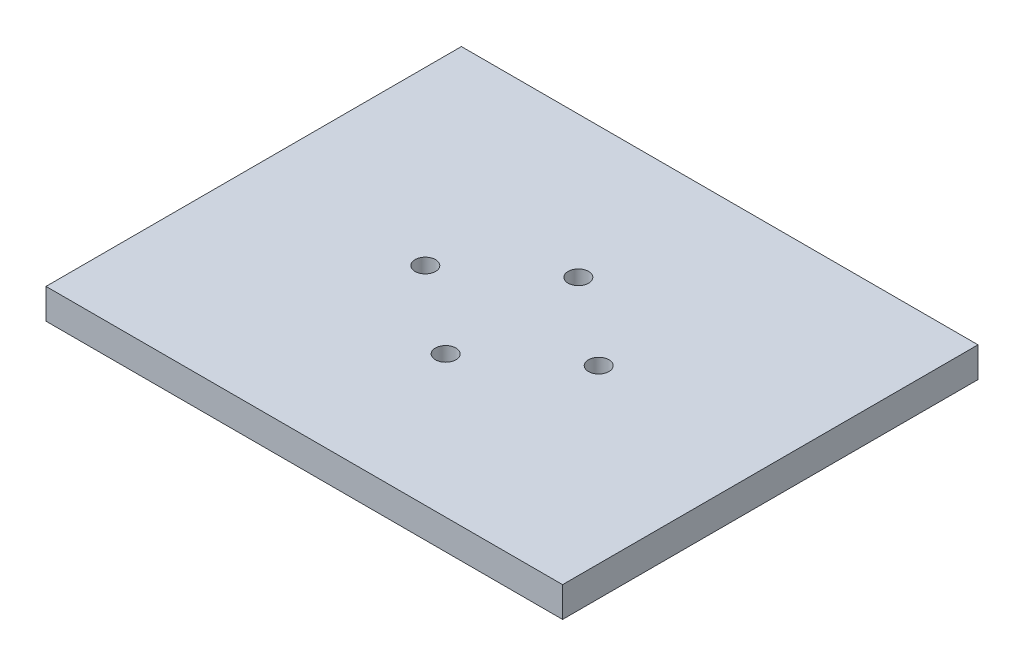
ISO-10303-21;
HEADER;
FILE_DESCRIPTION(('STEP AP214'),'2;1');
FILE_NAME('part.step','',(''),(''),'','','');
FILE_SCHEMA(('AUTOMOTIVE_DESIGN { 1 0 10303 214 1 1 1 1 }'));
ENDSEC;
DATA;
#1=APPLICATION_CONTEXT('core data for automotive mechanical design processes');
#2=APPLICATION_PROTOCOL_DEFINITION('international standard','automotive_design',2000,#1);
#3=PRODUCT_CONTEXT('',#1,'mechanical');
#4=PRODUCT('Part','Part','',(#3));
#5=PRODUCT_RELATED_PRODUCT_CATEGORY('part','',(#4));
#6=PRODUCT_DEFINITION_FORMATION('','',#4);
#7=PRODUCT_DEFINITION_CONTEXT('part definition',#1,'design');
#8=PRODUCT_DEFINITION('design','',#6,#7);
#9=PRODUCT_DEFINITION_SHAPE('','',#8);
#10=(LENGTH_UNIT() NAMED_UNIT(*) SI_UNIT(.MILLI.,.METRE.));
#11=(NAMED_UNIT(*) PLANE_ANGLE_UNIT() SI_UNIT($,.RADIAN.));
#12=(NAMED_UNIT(*) SI_UNIT($,.STERADIAN.) SOLID_ANGLE_UNIT());
#13=UNCERTAINTY_MEASURE_WITH_UNIT(LENGTH_MEASURE(1.E-05),#10,'distance_accuracy_value','');
#14=(GEOMETRIC_REPRESENTATION_CONTEXT(3) GLOBAL_UNCERTAINTY_ASSIGNED_CONTEXT((#13)) GLOBAL_UNIT_ASSIGNED_CONTEXT((#10,
#11,#12)) REPRESENTATION_CONTEXT('',''));
#15=CARTESIAN_POINT('',(0.,0.,0.));
#16=DIRECTION('',(0.,0.,1.));
#17=DIRECTION('',(1.,0.,0.));
#18=AXIS2_PLACEMENT_3D('',#15,#16,#17);
#19=CARTESIAN_POINT('',(0.,5.,0.));
#20=DIRECTION('',(0.,1.,0.));
#21=DIRECTION('',(0.,0.,1.));
#22=AXIS2_PLACEMENT_3D('',#19,#20,#21);
#23=PLANE('',#22);
#24=CARTESIAN_POINT('',(14.375,5.,0.));
#25=DIRECTION('',(0.,1.,0.));
#26=DIRECTION('',(0.,0.,-1.));
#27=AXIS2_PLACEMENT_3D('',#24,#25,#26);
#28=CIRCLE('',#27,1.7);
#29=CARTESIAN_POINT('',(14.375,5.,-1.7));
#30=VERTEX_POINT('',#29);
#31=EDGE_CURVE('E140',#30,#30,#28,.T.);
#32=ORIENTED_EDGE('',*,*,#31,.F.);
#33=EDGE_LOOP('',(#32));
#34=FACE_BOUND('',#33,.T.);
#35=CARTESIAN_POINT('',(0.,5.,11.));
#36=DIRECTION('',(0.,1.,0.));
#37=DIRECTION('',(0.,0.,-1.));
#38=AXIS2_PLACEMENT_3D('',#35,#36,#37);
#39=CIRCLE('',#38,1.7);
#40=CARTESIAN_POINT('',(0.,5.,9.3));
#41=VERTEX_POINT('',#40);
#42=EDGE_CURVE('E106',#41,#41,#39,.T.);
#43=ORIENTED_EDGE('',*,*,#42,.F.);
#44=EDGE_LOOP('',(#43));
#45=FACE_BOUND('',#44,.T.);
#46=DIRECTION('',(0.,0.,1.));
#47=VECTOR('',#46,1.);
#48=CARTESIAN_POINT('',(-42.825,5.,-26.7384129409898));
#49=LINE('',#48,#47);
#50=CARTESIAN_POINT('',(-42.825,5.,-34.4377431906615));
#51=VERTEX_POINT('',#50);
#52=CARTESIAN_POINT('',(-42.825,5.,34.4377431906615));
#53=VERTEX_POINT('',#52);
#54=EDGE_CURVE('E81',#51,#53,#49,.T.);
#55=ORIENTED_EDGE('',*,*,#54,.T.);
#56=DIRECTION('',(1.,0.,0.));
#57=VECTOR('',#56,1.);
#58=CARTESIAN_POINT('',(-42.825,5.,34.4377431906615));
#59=LINE('',#58,#57);
#60=CARTESIAN_POINT('',(42.825,5.,34.4377431906615));
#61=VERTEX_POINT('',#60);
#62=EDGE_CURVE('E84',#53,#61,#59,.T.);
#63=ORIENTED_EDGE('',*,*,#62,.T.);
#64=DIRECTION('',(0.,0.,-1.));
#65=VECTOR('',#64,1.);
#66=CARTESIAN_POINT('',(42.825,5.,34.4377431906615));
#67=LINE('',#66,#65);
#68=CARTESIAN_POINT('',(42.825,5.,-34.4377431906615));
#69=VERTEX_POINT('',#68);
#70=EDGE_CURVE('E88',#61,#69,#67,.T.);
#71=ORIENTED_EDGE('',*,*,#70,.T.);
#72=DIRECTION('',(-1.,0.,0.));
#73=VECTOR('',#72,1.);
#74=CARTESIAN_POINT('',(42.825,5.,-34.4377431906615));
#75=LINE('',#74,#73);
#76=EDGE_CURVE('E56',#69,#51,#75,.T.);
#77=ORIENTED_EDGE('',*,*,#76,.T.);
#78=EDGE_LOOP('',(#55,#63,#71,#77));
#79=FACE_BOUND('',#78,.T.);
#80=CARTESIAN_POINT('',(0.,5.,-11.));
#81=DIRECTION('',(0.,1.,0.));
#82=DIRECTION('',(0.,0.,1.));
#83=AXIS2_PLACEMENT_3D('',#80,#81,#82);
#84=CIRCLE('',#83,1.7);
#85=CARTESIAN_POINT('',(0.,5.,-9.3));
#86=VERTEX_POINT('',#85);
#87=EDGE_CURVE('E144',#86,#86,#84,.T.);
#88=ORIENTED_EDGE('',*,*,#87,.F.);
#89=EDGE_LOOP('',(#88));
#90=FACE_BOUND('',#89,.T.);
#91=CARTESIAN_POINT('',(-14.375,5.,0.));
#92=DIRECTION('',(0.,1.,0.));
#93=DIRECTION('',(0.,0.,1.));
#94=AXIS2_PLACEMENT_3D('',#91,#92,#93);
#95=CIRCLE('',#94,1.7);
#96=CARTESIAN_POINT('',(-14.375,5.,1.7));
#97=VERTEX_POINT('',#96);
#98=EDGE_CURVE('E135',#97,#97,#95,.T.);
#99=ORIENTED_EDGE('',*,*,#98,.F.);
#100=EDGE_LOOP('',(#99));
#101=FACE_BOUND('',#100,.T.);
#102=ADVANCED_FACE('F39',(#34,#45,#79,#90,#101),#23,.T.);
#103=CARTESIAN_POINT('',(0.,0.,0.));
#104=DIRECTION('',(0.,1.,0.));
#105=DIRECTION('',(0.,0.,1.));
#106=AXIS2_PLACEMENT_3D('',#103,#104,#105);
#107=PLANE('',#106);
#108=DIRECTION('',(1.,0.,0.));
#109=VECTOR('',#108,1.);
#110=CARTESIAN_POINT('',(33.2505102862954,0.,34.4377431906615));
#111=LINE('',#110,#109);
#112=CARTESIAN_POINT('',(-42.825,0.,34.4377431906615));
#113=VERTEX_POINT('',#112);
#114=CARTESIAN_POINT('',(42.825,0.,34.4377431906615));
#115=VERTEX_POINT('',#114);
#116=EDGE_CURVE('E95',#113,#115,#111,.T.);
#117=ORIENTED_EDGE('',*,*,#116,.F.);
#118=DIRECTION('',(0.,0.,1.));
#119=VECTOR('',#118,1.);
#120=CARTESIAN_POINT('',(-42.825,0.,-34.4377431906615));
#121=LINE('',#120,#119);
#122=CARTESIAN_POINT('',(-42.825,0.,-34.4377431906615));
#123=VERTEX_POINT('',#122);
#124=EDGE_CURVE('E109',#123,#113,#121,.T.);
#125=ORIENTED_EDGE('',*,*,#124,.F.);
#126=DIRECTION('',(-1.,0.,0.));
#127=VECTOR('',#126,1.);
#128=CARTESIAN_POINT('',(-33.2505102862954,0.,-34.4377431906615));
#129=LINE('',#128,#127);
#130=CARTESIAN_POINT('',(42.825,0.,-34.4377431906615));
#131=VERTEX_POINT('',#130);
#132=EDGE_CURVE('E72',#131,#123,#129,.T.);
#133=ORIENTED_EDGE('',*,*,#132,.F.);
#134=DIRECTION('',(0.,0.,-1.));
#135=VECTOR('',#134,1.);
#136=CARTESIAN_POINT('',(42.825,0.,-26.7384129409898));
#137=LINE('',#136,#135);
#138=EDGE_CURVE('E105',#115,#131,#137,.T.);
#139=ORIENTED_EDGE('',*,*,#138,.F.);
#140=EDGE_LOOP('',(#117,#125,#133,#139));
#141=FACE_BOUND('',#140,.T.);
#142=CARTESIAN_POINT('',(0.,0.,11.));
#143=DIRECTION('',(0.,1.,0.));
#144=DIRECTION('',(0.,0.,-1.));
#145=AXIS2_PLACEMENT_3D('',#142,#143,#144);
#146=CIRCLE('',#145,1.7);
#147=CARTESIAN_POINT('',(0.,0.,9.3));
#148=VERTEX_POINT('',#147);
#149=EDGE_CURVE('E122',#148,#148,#146,.T.);
#150=ORIENTED_EDGE('',*,*,#149,.T.);
#151=EDGE_LOOP('',(#150));
#152=FACE_BOUND('',#151,.T.);
#153=CARTESIAN_POINT('',(0.,0.,-11.));
#154=DIRECTION('',(0.,1.,0.));
#155=DIRECTION('',(0.,0.,1.));
#156=AXIS2_PLACEMENT_3D('',#153,#154,#155);
#157=CIRCLE('',#156,1.7);
#158=CARTESIAN_POINT('',(0.,0.,-9.3));
#159=VERTEX_POINT('',#158);
#160=EDGE_CURVE('E126',#159,#159,#157,.T.);
#161=ORIENTED_EDGE('',*,*,#160,.T.);
#162=EDGE_LOOP('',(#161));
#163=FACE_BOUND('',#162,.T.);
#164=CARTESIAN_POINT('',(14.375,0.,0.));
#165=DIRECTION('',(0.,1.,0.));
#166=DIRECTION('',(0.,0.,-1.));
#167=AXIS2_PLACEMENT_3D('',#164,#165,#166);
#168=CIRCLE('',#167,1.7);
#169=CARTESIAN_POINT('',(14.375,0.,-1.7));
#170=VERTEX_POINT('',#169);
#171=EDGE_CURVE('E130',#170,#170,#168,.T.);
#172=ORIENTED_EDGE('',*,*,#171,.T.);
#173=EDGE_LOOP('',(#172));
#174=FACE_BOUND('',#173,.T.);
#175=CARTESIAN_POINT('',(-14.375,0.,0.));
#176=DIRECTION('',(0.,1.,0.));
#177=DIRECTION('',(0.,0.,1.));
#178=AXIS2_PLACEMENT_3D('',#175,#176,#177);
#179=CIRCLE('',#178,1.7);
#180=CARTESIAN_POINT('',(-14.375,0.,1.7));
#181=VERTEX_POINT('',#180);
#182=EDGE_CURVE('E133',#181,#181,#179,.T.);
#183=ORIENTED_EDGE('',*,*,#182,.T.);
#184=EDGE_LOOP('',(#183));
#185=FACE_BOUND('',#184,.T.);
#186=ADVANCED_FACE('F115',(#141,#152,#163,#174,#185),#107,.F.);
#187=CARTESIAN_POINT('',(33.2505102862954,5.,34.4377431906615));
#188=DIRECTION('',(0.,0.,-1.));
#189=DIRECTION('',(-1.,0.,0.));
#190=AXIS2_PLACEMENT_3D('',#187,#188,#189);
#191=PLANE('',#190);
#192=ORIENTED_EDGE('',*,*,#116,.T.);
#193=DIRECTION('',(0.,-1.,0.));
#194=VECTOR('',#193,1.);
#195=CARTESIAN_POINT('',(42.825,5.,34.4377431906615));
#196=LINE('',#195,#194);
#197=EDGE_CURVE('E48',#61,#115,#196,.T.);
#198=ORIENTED_EDGE('',*,*,#197,.F.);
#199=ORIENTED_EDGE('',*,*,#62,.F.);
#200=DIRECTION('',(0.,-1.,0.));
#201=VECTOR('',#200,1.);
#202=CARTESIAN_POINT('',(-42.825,5.,34.4377431906615));
#203=LINE('',#202,#201);
#204=EDGE_CURVE('E11',#53,#113,#203,.T.);
#205=ORIENTED_EDGE('',*,*,#204,.T.);
#206=EDGE_LOOP('',(#192,#198,#199,#205));
#207=FACE_BOUND('',#206,.T.);
#208=ADVANCED_FACE('F41',(#207),#191,.F.);
#209=CARTESIAN_POINT('',(42.825,5.,-26.7384129409898));
#210=DIRECTION('',(-1.,0.,0.));
#211=DIRECTION('',(0.,0.,1.));
#212=AXIS2_PLACEMENT_3D('',#209,#210,#211);
#213=PLANE('',#212);
#214=ORIENTED_EDGE('',*,*,#138,.T.);
#215=DIRECTION('',(0.,-1.,0.));
#216=VECTOR('',#215,1.);
#217=CARTESIAN_POINT('',(42.825,5.,-34.4377431906615));
#218=LINE('',#217,#216);
#219=EDGE_CURVE('E97',#69,#131,#218,.T.);
#220=ORIENTED_EDGE('',*,*,#219,.F.);
#221=ORIENTED_EDGE('',*,*,#70,.F.);
#222=ORIENTED_EDGE('',*,*,#197,.T.);
#223=EDGE_LOOP('',(#214,#220,#221,#222));
#224=FACE_BOUND('',#223,.T.);
#225=ADVANCED_FACE('F98',(#224),#213,.F.);
#226=CARTESIAN_POINT('',(-33.2505102862954,5.,-34.4377431906615));
#227=DIRECTION('',(0.,0.,1.));
#228=DIRECTION('',(1.,0.,0.));
#229=AXIS2_PLACEMENT_3D('',#226,#227,#228);
#230=PLANE('',#229);
#231=ORIENTED_EDGE('',*,*,#132,.T.);
#232=DIRECTION('',(0.,-1.,0.));
#233=VECTOR('',#232,1.);
#234=CARTESIAN_POINT('',(-42.825,5.,-34.4377431906615));
#235=LINE('',#234,#233);
#236=EDGE_CURVE('E100',#51,#123,#235,.T.);
#237=ORIENTED_EDGE('',*,*,#236,.F.);
#238=ORIENTED_EDGE('',*,*,#76,.F.);
#239=ORIENTED_EDGE('',*,*,#219,.T.);
#240=EDGE_LOOP('',(#231,#237,#238,#239));
#241=FACE_BOUND('',#240,.T.);
#242=ADVANCED_FACE('F112',(#241),#230,.F.);
#243=CARTESIAN_POINT('',(-42.825,5.,-34.4377431906615));
#244=DIRECTION('',(1.,0.,0.));
#245=DIRECTION('',(0.,0.,-1.));
#246=AXIS2_PLACEMENT_3D('',#243,#244,#245);
#247=PLANE('',#246);
#248=ORIENTED_EDGE('',*,*,#124,.T.);
#249=ORIENTED_EDGE('',*,*,#204,.F.);
#250=ORIENTED_EDGE('',*,*,#54,.F.);
#251=ORIENTED_EDGE('',*,*,#236,.T.);
#252=EDGE_LOOP('',(#248,#249,#250,#251));
#253=FACE_BOUND('',#252,.T.);
#254=ADVANCED_FACE('F114',(#253),#247,.F.);
#255=CARTESIAN_POINT('',(0.,5.,11.));
#256=DIRECTION('',(0.,-1.,0.));
#257=DIRECTION('',(0.,0.,-1.));
#258=AXIS2_PLACEMENT_3D('',#255,#256,#257);
#259=CYLINDRICAL_SURFACE('',#258,1.7);
#260=ORIENTED_EDGE('',*,*,#42,.T.);
#261=EDGE_LOOP('',(#260));
#262=FACE_BOUND('',#261,.T.);
#263=ORIENTED_EDGE('',*,*,#149,.F.);
#264=EDGE_LOOP('',(#263));
#265=FACE_BOUND('',#264,.T.);
#266=ADVANCED_FACE('F152',(#262,#265),#259,.F.);
#267=CARTESIAN_POINT('',(0.,5.,-11.));
#268=DIRECTION('',(0.,-1.,0.));
#269=DIRECTION('',(0.,0.,-1.));
#270=AXIS2_PLACEMENT_3D('',#267,#268,#269);
#271=CYLINDRICAL_SURFACE('',#270,1.7);
#272=ORIENTED_EDGE('',*,*,#87,.T.);
#273=EDGE_LOOP('',(#272));
#274=FACE_BOUND('',#273,.T.);
#275=ORIENTED_EDGE('',*,*,#160,.F.);
#276=EDGE_LOOP('',(#275));
#277=FACE_BOUND('',#276,.T.);
#278=ADVANCED_FACE('F216',(#274,#277),#271,.F.);
#279=CARTESIAN_POINT('',(14.375,5.,0.));
#280=DIRECTION('',(0.,-1.,0.));
#281=DIRECTION('',(0.,0.,-1.));
#282=AXIS2_PLACEMENT_3D('',#279,#280,#281);
#283=CYLINDRICAL_SURFACE('',#282,1.7);
#284=ORIENTED_EDGE('',*,*,#31,.T.);
#285=EDGE_LOOP('',(#284));
#286=FACE_BOUND('',#285,.T.);
#287=ORIENTED_EDGE('',*,*,#171,.F.);
#288=EDGE_LOOP('',(#287));
#289=FACE_BOUND('',#288,.T.);
#290=ADVANCED_FACE('F224',(#286,#289),#283,.F.);
#291=CARTESIAN_POINT('',(-14.375,5.,0.));
#292=DIRECTION('',(0.,-1.,0.));
#293=DIRECTION('',(0.,0.,-1.));
#294=AXIS2_PLACEMENT_3D('',#291,#292,#293);
#295=CYLINDRICAL_SURFACE('',#294,1.7);
#296=ORIENTED_EDGE('',*,*,#98,.T.);
#297=EDGE_LOOP('',(#296));
#298=FACE_BOUND('',#297,.T.);
#299=ORIENTED_EDGE('',*,*,#182,.F.);
#300=EDGE_LOOP('',(#299));
#301=FACE_BOUND('',#300,.T.);
#302=ADVANCED_FACE('F232',(#298,#301),#295,.F.);
#303=CLOSED_SHELL('',(#102,#186,#208,#225,#242,#254,#266,#278,#290,#302));
#304=MANIFOLD_SOLID_BREP('B2',#303);
#305=ADVANCED_BREP_SHAPE_REPRESENTATION('',(#18,#304),#14);
#306=SHAPE_DEFINITION_REPRESENTATION(#9,#305);
ENDSEC;
END-ISO-10303-21;
